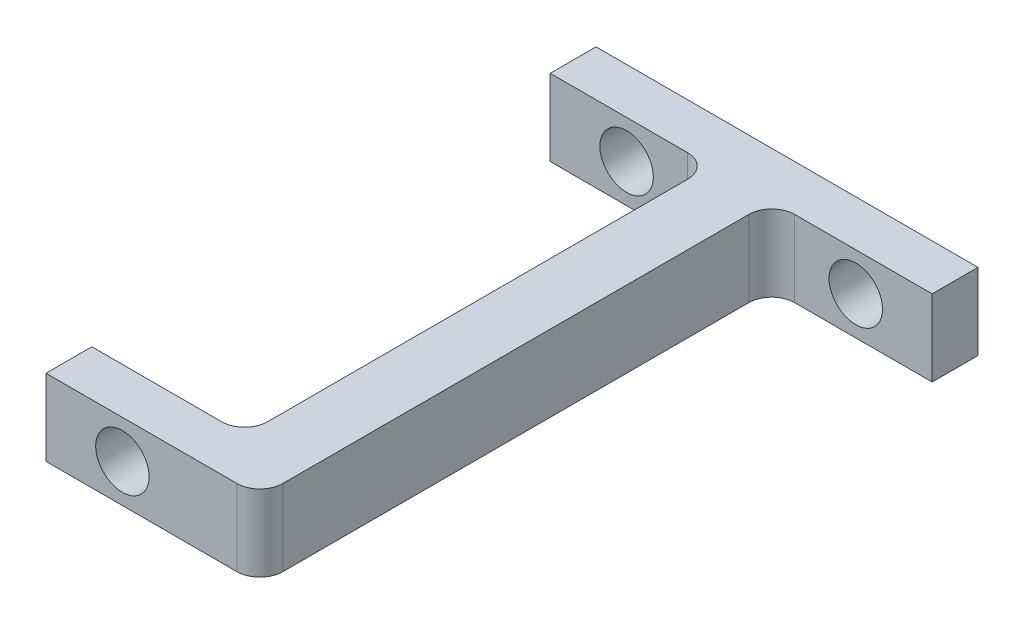
ISO-10303-21;
HEADER;
FILE_DESCRIPTION(('STEP AP214'),'2;1');
FILE_NAME('part.step','',(''),(''),'','','');
FILE_SCHEMA(('AUTOMOTIVE_DESIGN { 1 0 10303 214 1 1 1 1 }'));
ENDSEC;
DATA;
#1=APPLICATION_CONTEXT('core data for automotive mechanical design processes');
#2=APPLICATION_PROTOCOL_DEFINITION('international standard','automotive_design',2000,#1);
#3=PRODUCT_CONTEXT('',#1,'mechanical');
#4=PRODUCT('Part','Part','',(#3));
#5=PRODUCT_RELATED_PRODUCT_CATEGORY('part','',(#4));
#6=PRODUCT_DEFINITION_FORMATION('','',#4);
#7=PRODUCT_DEFINITION_CONTEXT('part definition',#1,'design');
#8=PRODUCT_DEFINITION('design','',#6,#7);
#9=PRODUCT_DEFINITION_SHAPE('','',#8);
#10=(LENGTH_UNIT() NAMED_UNIT(*) SI_UNIT(.MILLI.,.METRE.));
#11=(NAMED_UNIT(*) PLANE_ANGLE_UNIT() SI_UNIT($,.RADIAN.));
#12=(NAMED_UNIT(*) SI_UNIT($,.STERADIAN.) SOLID_ANGLE_UNIT());
#13=UNCERTAINTY_MEASURE_WITH_UNIT(LENGTH_MEASURE(1.E-05),#10,'distance_accuracy_value','');
#14=(GEOMETRIC_REPRESENTATION_CONTEXT(3) GLOBAL_UNCERTAINTY_ASSIGNED_CONTEXT((#13)) GLOBAL_UNIT_ASSIGNED_CONTEXT((#10,
#11,#12)) REPRESENTATION_CONTEXT('',''));
#15=CARTESIAN_POINT('',(0.,0.,0.));
#16=DIRECTION('',(0.,0.,1.));
#17=DIRECTION('',(1.,0.,0.));
#18=AXIS2_PLACEMENT_3D('',#15,#16,#17);
#19=CARTESIAN_POINT('',(-2.,-2.5,36.5));
#20=DIRECTION('',(1.,0.,0.));
#21=DIRECTION('',(0.,0.,-1.));
#22=AXIS2_PLACEMENT_3D('',#19,#20,#21);
#23=PLANE('',#22);
#24=DIRECTION('',(0.,0.,-1.));
#25=VECTOR('',#24,1.);
#26=CARTESIAN_POINT('',(-2.,2.5,36.5));
#27=LINE('',#26,#25);
#28=CARTESIAN_POINT('',(-2.,2.5,32.));
#29=VERTEX_POINT('',#28);
#30=CARTESIAN_POINT('',(-2.,2.5,4.5));
#31=VERTEX_POINT('',#30);
#32=EDGE_CURVE('E156',#29,#31,#27,.T.);
#33=ORIENTED_EDGE('',*,*,#32,.T.);
#34=DIRECTION('',(0.,-1.,0.));
#35=VECTOR('',#34,1.);
#36=CARTESIAN_POINT('',(-2.,-2.5,4.5));
#37=LINE('',#36,#35);
#38=CARTESIAN_POINT('',(-2.,-2.5,4.5));
#39=VERTEX_POINT('',#38);
#40=EDGE_CURVE('E284',#31,#39,#37,.T.);
#41=ORIENTED_EDGE('',*,*,#40,.T.);
#42=DIRECTION('',(0.,0.,-1.));
#43=VECTOR('',#42,1.);
#44=CARTESIAN_POINT('',(-2.,-2.5,36.5));
#45=LINE('',#44,#43);
#46=CARTESIAN_POINT('',(-2.,-2.5,32.));
#47=VERTEX_POINT('',#46);
#48=EDGE_CURVE('E205',#47,#39,#45,.T.);
#49=ORIENTED_EDGE('',*,*,#48,.F.);
#50=DIRECTION('',(0.,-1.,0.));
#51=VECTOR('',#50,1.);
#52=CARTESIAN_POINT('',(-2.,2.5,32.));
#53=LINE('',#52,#51);
#54=EDGE_CURVE('E281',#47,#29,#53,.F.);
#55=ORIENTED_EDGE('',*,*,#54,.T.);
#56=EDGE_LOOP('',(#33,#41,#49,#55));
#57=FACE_BOUND('',#56,.T.);
#58=ADVANCED_FACE('F45',(#57),#23,.F.);
#59=CARTESIAN_POINT('',(0.,0.,3.));
#60=DIRECTION('',(0.,0.,-1.));
#61=DIRECTION('',(-1.,0.,0.));
#62=AXIS2_PLACEMENT_3D('',#59,#60,#61);
#63=PLANE('',#62);
#64=CARTESIAN_POINT('',(-7.5,0.,3.));
#65=DIRECTION('',(0.,0.,1.));
#66=DIRECTION('',(1.,0.,0.));
#67=AXIS2_PLACEMENT_3D('',#64,#65,#66);
#68=CIRCLE('',#67,1.75);
#69=CARTESIAN_POINT('',(-5.75,0.,3.));
#70=VERTEX_POINT('',#69);
#71=EDGE_CURVE('E218',#70,#70,#68,.T.);
#72=ORIENTED_EDGE('',*,*,#71,.F.);
#73=EDGE_LOOP('',(#72));
#74=FACE_BOUND('',#73,.T.);
#75=DIRECTION('',(1.,0.,0.));
#76=VECTOR('',#75,1.);
#77=CARTESIAN_POINT('',(-12.5,-2.5,3.));
#78=LINE('',#77,#76);
#79=CARTESIAN_POINT('',(-12.5,-2.5,3.));
#80=VERTEX_POINT('',#79);
#81=CARTESIAN_POINT('',(-3.5,-2.5,3.));
#82=VERTEX_POINT('',#81);
#83=EDGE_CURVE('E240',#80,#82,#78,.T.);
#84=ORIENTED_EDGE('',*,*,#83,.T.);
#85=DIRECTION('',(0.,-1.,0.));
#86=VECTOR('',#85,1.);
#87=CARTESIAN_POINT('',(-3.5,2.5,3.));
#88=LINE('',#87,#86);
#89=CARTESIAN_POINT('',(-3.5,2.5,3.));
#90=VERTEX_POINT('',#89);
#91=EDGE_CURVE('E288',#82,#90,#88,.F.);
#92=ORIENTED_EDGE('',*,*,#91,.T.);
#93=DIRECTION('',(-1.,0.,0.));
#94=VECTOR('',#93,1.);
#95=CARTESIAN_POINT('',(-12.5,2.5,3.));
#96=LINE('',#95,#94);
#97=CARTESIAN_POINT('',(-12.5,2.5,3.));
#98=VERTEX_POINT('',#97);
#99=EDGE_CURVE('E230',#90,#98,#96,.T.);
#100=ORIENTED_EDGE('',*,*,#99,.T.);
#101=DIRECTION('',(0.,-1.,0.));
#102=VECTOR('',#101,1.);
#103=CARTESIAN_POINT('',(-12.5,-2.5,3.));
#104=LINE('',#103,#102);
#105=EDGE_CURVE('E236',#98,#80,#104,.T.);
#106=ORIENTED_EDGE('',*,*,#105,.T.);
#107=EDGE_LOOP('',(#84,#92,#100,#106));
#108=FACE_BOUND('',#107,.T.);
#109=ADVANCED_FACE('F357',(#74,#108),#63,.F.);
#110=CARTESIAN_POINT('',(7.5,0.,3.));
#111=DIRECTION('',(0.,0.,1.));
#112=DIRECTION('',(-1.,0.,0.));
#113=AXIS2_PLACEMENT_3D('',#110,#111,#112);
#114=CIRCLE('',#113,1.75);
#115=CARTESIAN_POINT('',(5.75,0.,3.));
#116=VERTEX_POINT('',#115);
#117=EDGE_CURVE('E210',#116,#116,#114,.T.);
#118=ORIENTED_EDGE('',*,*,#117,.F.);
#119=EDGE_LOOP('',(#118));
#120=FACE_BOUND('',#119,.T.);
#121=CARTESIAN_POINT('',(12.5,2.5,3.));
#122=VERTEX_POINT('',#121);
#123=CARTESIAN_POINT('',(3.5,2.5,3.));
#124=VERTEX_POINT('',#123);
#125=EDGE_CURVE('E232',#122,#124,#96,.T.);
#126=ORIENTED_EDGE('',*,*,#125,.T.);
#127=DIRECTION('',(0.,1.,0.));
#128=VECTOR('',#127,1.);
#129=CARTESIAN_POINT('',(3.5,-2.5,3.));
#130=LINE('',#129,#128);
#131=CARTESIAN_POINT('',(3.5,-2.5,3.));
#132=VERTEX_POINT('',#131);
#133=EDGE_CURVE('E278',#124,#132,#130,.F.);
#134=ORIENTED_EDGE('',*,*,#133,.T.);
#135=CARTESIAN_POINT('',(12.5,-2.5,3.));
#136=VERTEX_POINT('',#135);
#137=EDGE_CURVE('E239',#132,#136,#78,.T.);
#138=ORIENTED_EDGE('',*,*,#137,.T.);
#139=DIRECTION('',(0.,1.,0.));
#140=VECTOR('',#139,1.);
#141=CARTESIAN_POINT('',(12.5,-2.5,3.));
#142=LINE('',#141,#140);
#143=EDGE_CURVE('E226',#136,#122,#142,.T.);
#144=ORIENTED_EDGE('',*,*,#143,.T.);
#145=EDGE_LOOP('',(#126,#134,#138,#144));
#146=FACE_BOUND('',#145,.T.);
#147=ADVANCED_FACE('F337',(#120,#146),#63,.F.);
#148=CARTESIAN_POINT('',(0.,0.,0.));
#149=DIRECTION('',(0.,0.,-1.));
#150=DIRECTION('',(-1.,0.,0.));
#151=AXIS2_PLACEMENT_3D('',#148,#149,#150);
#152=PLANE('',#151);
#153=CARTESIAN_POINT('',(-7.5,0.,0.));
#154=DIRECTION('',(0.,0.,1.));
#155=DIRECTION('',(1.,0.,0.));
#156=AXIS2_PLACEMENT_3D('',#153,#154,#155);
#157=CIRCLE('',#156,1.75);
#158=CARTESIAN_POINT('',(-5.75,0.,0.));
#159=VERTEX_POINT('',#158);
#160=EDGE_CURVE('E214',#159,#159,#157,.T.);
#161=ORIENTED_EDGE('',*,*,#160,.T.);
#162=EDGE_LOOP('',(#161));
#163=FACE_BOUND('',#162,.T.);
#164=DIRECTION('',(0.,1.,0.));
#165=VECTOR('',#164,1.);
#166=CARTESIAN_POINT('',(12.5,-2.5,0.));
#167=LINE('',#166,#165);
#168=CARTESIAN_POINT('',(12.5,-2.5,0.));
#169=VERTEX_POINT('',#168);
#170=CARTESIAN_POINT('',(12.5,2.5,0.));
#171=VERTEX_POINT('',#170);
#172=EDGE_CURVE('E222',#169,#171,#167,.T.);
#173=ORIENTED_EDGE('',*,*,#172,.F.);
#174=DIRECTION('',(1.,0.,0.));
#175=VECTOR('',#174,1.);
#176=CARTESIAN_POINT('',(-12.5,-2.5,0.));
#177=LINE('',#176,#175);
#178=CARTESIAN_POINT('',(-12.5,-2.5,0.));
#179=VERTEX_POINT('',#178);
#180=EDGE_CURVE('E231',#179,#169,#177,.T.);
#181=ORIENTED_EDGE('',*,*,#180,.F.);
#182=DIRECTION('',(0.,-1.,0.));
#183=VECTOR('',#182,1.);
#184=CARTESIAN_POINT('',(-12.5,-2.5,0.));
#185=LINE('',#184,#183);
#186=CARTESIAN_POINT('',(-12.5,2.5,0.));
#187=VERTEX_POINT('',#186);
#188=EDGE_CURVE('E251',#187,#179,#185,.T.);
#189=ORIENTED_EDGE('',*,*,#188,.F.);
#190=DIRECTION('',(-1.,0.,0.));
#191=VECTOR('',#190,1.);
#192=CARTESIAN_POINT('',(-12.5,2.5,0.));
#193=LINE('',#192,#191);
#194=EDGE_CURVE('E248',#171,#187,#193,.T.);
#195=ORIENTED_EDGE('',*,*,#194,.F.);
#196=EDGE_LOOP('',(#173,#181,#189,#195));
#197=FACE_BOUND('',#196,.T.);
#198=CARTESIAN_POINT('',(7.5,0.,0.));
#199=DIRECTION('',(0.,0.,1.));
#200=DIRECTION('',(-1.,0.,0.));
#201=AXIS2_PLACEMENT_3D('',#198,#199,#200);
#202=CIRCLE('',#201,1.75);
#203=CARTESIAN_POINT('',(5.75,0.,0.));
#204=VERTEX_POINT('',#203);
#205=EDGE_CURVE('E209',#204,#204,#202,.T.);
#206=ORIENTED_EDGE('',*,*,#205,.T.);
#207=EDGE_LOOP('',(#206));
#208=FACE_BOUND('',#207,.T.);
#209=ADVANCED_FACE('F352',(#163,#197,#208),#152,.T.);
#210=CARTESIAN_POINT('',(12.5,-2.5,3.));
#211=DIRECTION('',(-1.,0.,0.));
#212=DIRECTION('',(0.,0.,1.));
#213=AXIS2_PLACEMENT_3D('',#210,#211,#212);
#214=PLANE('',#213);
#215=ORIENTED_EDGE('',*,*,#172,.T.);
#216=DIRECTION('',(0.,0.,-1.));
#217=VECTOR('',#216,1.);
#218=CARTESIAN_POINT('',(12.5,2.5,3.));
#219=LINE('',#218,#217);
#220=EDGE_CURVE('E267',#122,#171,#219,.T.);
#221=ORIENTED_EDGE('',*,*,#220,.F.);
#222=ORIENTED_EDGE('',*,*,#143,.F.);
#223=DIRECTION('',(0.,0.,-1.));
#224=VECTOR('',#223,1.);
#225=CARTESIAN_POINT('',(12.5,-2.5,3.));
#226=LINE('',#225,#224);
#227=EDGE_CURVE('E244',#136,#169,#226,.T.);
#228=ORIENTED_EDGE('',*,*,#227,.T.);
#229=EDGE_LOOP('',(#215,#221,#222,#228));
#230=FACE_BOUND('',#229,.T.);
#231=ADVANCED_FACE('F341',(#230),#214,.F.);
#232=CARTESIAN_POINT('',(-12.5,2.5,3.));
#233=DIRECTION('',(0.,-1.,0.));
#234=DIRECTION('',(0.,0.,-1.));
#235=AXIS2_PLACEMENT_3D('',#232,#233,#234);
#236=PLANE('',#235);
#237=DIRECTION('',(-1.,0.,0.));
#238=VECTOR('',#237,1.);
#239=CARTESIAN_POINT('',(2.,2.5,36.5));
#240=LINE('',#239,#238);
#241=CARTESIAN_POINT('',(0.500000000000002,2.5,36.5));
#242=VERTEX_POINT('',#241);
#243=CARTESIAN_POINT('',(-12.,2.5,36.5));
#244=VERTEX_POINT('',#243);
#245=EDGE_CURVE('E148',#242,#244,#240,.T.);
#246=ORIENTED_EDGE('',*,*,#245,.F.);
#247=CARTESIAN_POINT('',(0.500000000000002,2.5,35.));
#248=DIRECTION('',(0.,-1.,0.));
#249=DIRECTION('',(0.,0.,-1.));
#250=AXIS2_PLACEMENT_3D('',#247,#248,#249);
#251=CIRCLE('',#250,1.5);
#252=CARTESIAN_POINT('',(2.,2.5,35.));
#253=VERTEX_POINT('',#252);
#254=EDGE_CURVE('E69',#242,#253,#251,.F.);
#255=ORIENTED_EDGE('',*,*,#254,.T.);
#256=DIRECTION('',(0.,0.,-1.));
#257=VECTOR('',#256,1.);
#258=CARTESIAN_POINT('',(2.,2.5,36.5));
#259=LINE('',#258,#257);
#260=CARTESIAN_POINT('',(2.,2.5,4.5));
#261=VERTEX_POINT('',#260);
#262=EDGE_CURVE('E197',#253,#261,#259,.T.);
#263=ORIENTED_EDGE('',*,*,#262,.T.);
#264=CARTESIAN_POINT('',(3.5,2.5,4.5));
#265=DIRECTION('',(0.,-1.,0.));
#266=DIRECTION('',(0.,0.,-1.));
#267=AXIS2_PLACEMENT_3D('',#264,#265,#266);
#268=CIRCLE('',#267,1.5);
#269=EDGE_CURVE('E301',#261,#124,#268,.T.);
#270=ORIENTED_EDGE('',*,*,#269,.T.);
#271=ORIENTED_EDGE('',*,*,#125,.F.);
#272=ORIENTED_EDGE('',*,*,#220,.T.);
#273=ORIENTED_EDGE('',*,*,#194,.T.);
#274=DIRECTION('',(0.,0.,-1.));
#275=VECTOR('',#274,1.);
#276=CARTESIAN_POINT('',(-12.5,2.5,3.));
#277=LINE('',#276,#275);
#278=EDGE_CURVE('E263',#98,#187,#277,.T.);
#279=ORIENTED_EDGE('',*,*,#278,.F.);
#280=ORIENTED_EDGE('',*,*,#99,.F.);
#281=CARTESIAN_POINT('',(-3.5,2.5,4.5));
#282=DIRECTION('',(0.,-1.,0.));
#283=DIRECTION('',(0.,0.,-1.));
#284=AXIS2_PLACEMENT_3D('',#281,#282,#283);
#285=CIRCLE('',#284,1.5);
#286=EDGE_CURVE('E310',#90,#31,#285,.T.);
#287=ORIENTED_EDGE('',*,*,#286,.T.);
#288=ORIENTED_EDGE('',*,*,#32,.F.);
#289=CARTESIAN_POINT('',(-3.5,2.5,32.));
#290=DIRECTION('',(0.,-1.,0.));
#291=DIRECTION('',(0.,0.,-1.));
#292=AXIS2_PLACEMENT_3D('',#289,#290,#291);
#293=CIRCLE('',#292,1.5);
#294=CARTESIAN_POINT('',(-3.5,2.5,33.5));
#295=VERTEX_POINT('',#294);
#296=EDGE_CURVE('E11',#29,#295,#293,.T.);
#297=ORIENTED_EDGE('',*,*,#296,.T.);
#298=DIRECTION('',(1.,0.,0.));
#299=VECTOR('',#298,1.);
#300=CARTESIAN_POINT('',(-12.,2.5,33.5));
#301=LINE('',#300,#299);
#302=CARTESIAN_POINT('',(-12.,2.5,33.5));
#303=VERTEX_POINT('',#302);
#304=EDGE_CURVE('E163',#303,#295,#301,.T.);
#305=ORIENTED_EDGE('',*,*,#304,.F.);
#306=DIRECTION('',(0.,0.,-1.));
#307=VECTOR('',#306,1.);
#308=CARTESIAN_POINT('',(-12.,2.5,33.5));
#309=LINE('',#308,#307);
#310=EDGE_CURVE('E160',#244,#303,#309,.T.);
#311=ORIENTED_EDGE('',*,*,#310,.F.);
#312=EDGE_LOOP('',(#246,#255,#263,#270,#271,#272,#273,#279,#280,#287,#288,#297,#305,#311));
#313=FACE_BOUND('',#312,.T.);
#314=ADVANCED_FACE('F161',(#313),#236,.F.);
#315=CARTESIAN_POINT('',(-12.5,-2.5,3.));
#316=DIRECTION('',(1.,0.,0.));
#317=DIRECTION('',(0.,0.,-1.));
#318=AXIS2_PLACEMENT_3D('',#315,#316,#317);
#319=PLANE('',#318);
#320=ORIENTED_EDGE('',*,*,#188,.T.);
#321=DIRECTION('',(0.,0.,-1.));
#322=VECTOR('',#321,1.);
#323=CARTESIAN_POINT('',(-12.5,-2.5,3.));
#324=LINE('',#323,#322);
#325=EDGE_CURVE('E259',#80,#179,#324,.T.);
#326=ORIENTED_EDGE('',*,*,#325,.F.);
#327=ORIENTED_EDGE('',*,*,#105,.F.);
#328=ORIENTED_EDGE('',*,*,#278,.T.);
#329=EDGE_LOOP('',(#320,#326,#327,#328));
#330=FACE_BOUND('',#329,.T.);
#331=ADVANCED_FACE('F349',(#330),#319,.F.);
#332=CARTESIAN_POINT('',(-12.5,-2.5,3.));
#333=DIRECTION('',(0.,1.,0.));
#334=DIRECTION('',(0.,0.,1.));
#335=AXIS2_PLACEMENT_3D('',#332,#333,#334);
#336=PLANE('',#335);
#337=DIRECTION('',(0.,0.,-1.));
#338=VECTOR('',#337,1.);
#339=CARTESIAN_POINT('',(2.,-2.5,36.5));
#340=LINE('',#339,#338);
#341=CARTESIAN_POINT('',(2.,-2.5,35.));
#342=VERTEX_POINT('',#341);
#343=CARTESIAN_POINT('',(2.,-2.5,4.5));
#344=VERTEX_POINT('',#343);
#345=EDGE_CURVE('E201',#342,#344,#340,.T.);
#346=ORIENTED_EDGE('',*,*,#345,.F.);
#347=CARTESIAN_POINT('',(0.500000000000002,-2.5,35.));
#348=DIRECTION('',(0.,1.,0.));
#349=DIRECTION('',(0.,0.,1.));
#350=AXIS2_PLACEMENT_3D('',#347,#348,#349);
#351=CIRCLE('',#350,1.5);
#352=CARTESIAN_POINT('',(0.500000000000002,-2.5,36.5));
#353=VERTEX_POINT('',#352);
#354=EDGE_CURVE('E61',#342,#353,#351,.F.);
#355=ORIENTED_EDGE('',*,*,#354,.T.);
#356=DIRECTION('',(1.,0.,0.));
#357=VECTOR('',#356,1.);
#358=CARTESIAN_POINT('',(2.,-2.5,36.5));
#359=LINE('',#358,#357);
#360=CARTESIAN_POINT('',(-12.,-2.5,36.5));
#361=VERTEX_POINT('',#360);
#362=EDGE_CURVE('E157',#361,#353,#359,.T.);
#363=ORIENTED_EDGE('',*,*,#362,.F.);
#364=DIRECTION('',(0.,0.,1.));
#365=VECTOR('',#364,1.);
#366=CARTESIAN_POINT('',(-12.,-2.5,33.5));
#367=LINE('',#366,#365);
#368=CARTESIAN_POINT('',(-12.,-2.5,33.5));
#369=VERTEX_POINT('',#368);
#370=EDGE_CURVE('E172',#369,#361,#367,.T.);
#371=ORIENTED_EDGE('',*,*,#370,.F.);
#372=DIRECTION('',(1.,0.,0.));
#373=VECTOR('',#372,1.);
#374=CARTESIAN_POINT('',(-12.,-2.5,33.5));
#375=LINE('',#374,#373);
#376=CARTESIAN_POINT('',(-3.5,-2.5,33.5));
#377=VERTEX_POINT('',#376);
#378=EDGE_CURVE('E186',#369,#377,#375,.T.);
#379=ORIENTED_EDGE('',*,*,#378,.T.);
#380=CARTESIAN_POINT('',(-3.5,-2.5,32.));
#381=DIRECTION('',(0.,1.,0.));
#382=DIRECTION('',(0.,0.,1.));
#383=AXIS2_PLACEMENT_3D('',#380,#381,#382);
#384=CIRCLE('',#383,1.5);
#385=EDGE_CURVE('E54',#377,#47,#384,.T.);
#386=ORIENTED_EDGE('',*,*,#385,.T.);
#387=ORIENTED_EDGE('',*,*,#48,.T.);
#388=CARTESIAN_POINT('',(-3.5,-2.5,4.5));
#389=DIRECTION('',(0.,1.,0.));
#390=DIRECTION('',(0.,0.,1.));
#391=AXIS2_PLACEMENT_3D('',#388,#389,#390);
#392=CIRCLE('',#391,1.5);
#393=EDGE_CURVE('E307',#39,#82,#392,.T.);
#394=ORIENTED_EDGE('',*,*,#393,.T.);
#395=ORIENTED_EDGE('',*,*,#83,.F.);
#396=ORIENTED_EDGE('',*,*,#325,.T.);
#397=ORIENTED_EDGE('',*,*,#180,.T.);
#398=ORIENTED_EDGE('',*,*,#227,.F.);
#399=ORIENTED_EDGE('',*,*,#137,.F.);
#400=CARTESIAN_POINT('',(3.5,-2.5,4.5));
#401=DIRECTION('',(0.,1.,0.));
#402=DIRECTION('',(0.,0.,1.));
#403=AXIS2_PLACEMENT_3D('',#400,#401,#402);
#404=CIRCLE('',#403,1.5);
#405=EDGE_CURVE('E304',#132,#344,#404,.T.);
#406=ORIENTED_EDGE('',*,*,#405,.T.);
#407=EDGE_LOOP('',(#346,#355,#363,#371,#379,#386,#387,#394,#395,#396,#397,#398,#399,#406));
#408=FACE_BOUND('',#407,.T.);
#409=ADVANCED_FACE('F314',(#408),#336,.F.);
#410=CARTESIAN_POINT('',(-7.5,0.,3.));
#411=DIRECTION('',(0.,0.,-1.));
#412=DIRECTION('',(-1.,0.,0.));
#413=AXIS2_PLACEMENT_3D('',#410,#411,#412);
#414=CYLINDRICAL_SURFACE('',#413,1.75);
#415=ORIENTED_EDGE('',*,*,#71,.T.);
#416=EDGE_LOOP('',(#415));
#417=FACE_BOUND('',#416,.T.);
#418=ORIENTED_EDGE('',*,*,#160,.F.);
#419=EDGE_LOOP('',(#418));
#420=FACE_BOUND('',#419,.T.);
#421=ADVANCED_FACE('F385',(#417,#420),#414,.F.);
#422=CARTESIAN_POINT('',(7.5,0.,3.));
#423=DIRECTION('',(0.,0.,-1.));
#424=DIRECTION('',(-1.,0.,0.));
#425=AXIS2_PLACEMENT_3D('',#422,#423,#424);
#426=CYLINDRICAL_SURFACE('',#425,1.75);
#427=ORIENTED_EDGE('',*,*,#117,.T.);
#428=EDGE_LOOP('',(#427));
#429=FACE_BOUND('',#428,.T.);
#430=ORIENTED_EDGE('',*,*,#205,.F.);
#431=EDGE_LOOP('',(#430));
#432=FACE_BOUND('',#431,.T.);
#433=ADVANCED_FACE('F382',(#429,#432),#426,.F.);
#434=CARTESIAN_POINT('',(2.,-2.5,36.5));
#435=DIRECTION('',(-1.,0.,0.));
#436=DIRECTION('',(0.,0.,1.));
#437=AXIS2_PLACEMENT_3D('',#434,#435,#436);
#438=PLANE('',#437);
#439=ORIENTED_EDGE('',*,*,#345,.T.);
#440=DIRECTION('',(0.,1.,0.));
#441=VECTOR('',#440,1.);
#442=CARTESIAN_POINT('',(2.,2.5,4.5));
#443=LINE('',#442,#441);
#444=EDGE_CURVE('E274',#344,#261,#443,.T.);
#445=ORIENTED_EDGE('',*,*,#444,.T.);
#446=ORIENTED_EDGE('',*,*,#262,.F.);
#447=DIRECTION('',(0.,1.,0.));
#448=VECTOR('',#447,1.);
#449=CARTESIAN_POINT('',(2.,-2.5,35.));
#450=LINE('',#449,#448);
#451=EDGE_CURVE('E271',#253,#342,#450,.F.);
#452=ORIENTED_EDGE('',*,*,#451,.T.);
#453=EDGE_LOOP('',(#439,#445,#446,#452));
#454=FACE_BOUND('',#453,.T.);
#455=ADVANCED_FACE('F328',(#454),#438,.F.);
#456=CARTESIAN_POINT('',(0.,0.,36.5));
#457=DIRECTION('',(0.,0.,1.));
#458=DIRECTION('',(1.,0.,0.));
#459=AXIS2_PLACEMENT_3D('',#456,#457,#458);
#460=PLANE('',#459);
#461=CARTESIAN_POINT('',(-7.,0.,36.5));
#462=DIRECTION('',(0.,0.,1.));
#463=DIRECTION('',(1.,0.,0.));
#464=AXIS2_PLACEMENT_3D('',#461,#462,#463);
#465=CIRCLE('',#464,1.75);
#466=CARTESIAN_POINT('',(-5.25,0.,36.5));
#467=VERTEX_POINT('',#466);
#468=EDGE_CURVE('E174',#467,#467,#465,.T.);
#469=ORIENTED_EDGE('',*,*,#468,.F.);
#470=EDGE_LOOP('',(#469));
#471=FACE_BOUND('',#470,.T.);
#472=ORIENTED_EDGE('',*,*,#362,.T.);
#473=DIRECTION('',(0.,1.,0.));
#474=VECTOR('',#473,1.);
#475=CARTESIAN_POINT('',(0.500000000000002,2.5,36.5));
#476=LINE('',#475,#474);
#477=EDGE_CURVE('E153',#353,#242,#476,.T.);
#478=ORIENTED_EDGE('',*,*,#477,.T.);
#479=ORIENTED_EDGE('',*,*,#245,.T.);
#480=DIRECTION('',(0.,1.,0.));
#481=VECTOR('',#480,1.);
#482=CARTESIAN_POINT('',(-12.,-2.5,36.5));
#483=LINE('',#482,#481);
#484=EDGE_CURVE('E152',#361,#244,#483,.T.);
#485=ORIENTED_EDGE('',*,*,#484,.F.);
#486=EDGE_LOOP('',(#472,#478,#479,#485));
#487=FACE_BOUND('',#486,.T.);
#488=ADVANCED_FACE('F150',(#471,#487),#460,.T.);
#489=CARTESIAN_POINT('',(-12.,-2.5,33.5));
#490=DIRECTION('',(0.,0.,1.));
#491=DIRECTION('',(1.,0.,0.));
#492=AXIS2_PLACEMENT_3D('',#489,#490,#491);
#493=PLANE('',#492);
#494=CARTESIAN_POINT('',(-7.,0.,33.5));
#495=DIRECTION('',(0.,0.,-1.));
#496=DIRECTION('',(-1.,0.,0.));
#497=AXIS2_PLACEMENT_3D('',#494,#495,#496);
#498=CIRCLE('',#497,1.75);
#499=CARTESIAN_POINT('',(-8.75,0.,33.5));
#500=VERTEX_POINT('',#499);
#501=EDGE_CURVE('E178',#500,#500,#498,.T.);
#502=ORIENTED_EDGE('',*,*,#501,.F.);
#503=EDGE_LOOP('',(#502));
#504=FACE_BOUND('',#503,.T.);
#505=ORIENTED_EDGE('',*,*,#304,.T.);
#506=DIRECTION('',(0.,-1.,0.));
#507=VECTOR('',#506,1.);
#508=CARTESIAN_POINT('',(-3.5,-2.5,33.5));
#509=LINE('',#508,#507);
#510=EDGE_CURVE('E291',#295,#377,#509,.T.);
#511=ORIENTED_EDGE('',*,*,#510,.T.);
#512=ORIENTED_EDGE('',*,*,#378,.F.);
#513=DIRECTION('',(0.,-1.,0.));
#514=VECTOR('',#513,1.);
#515=CARTESIAN_POINT('',(-12.,-2.5,33.5));
#516=LINE('',#515,#514);
#517=EDGE_CURVE('E167',#303,#369,#516,.T.);
#518=ORIENTED_EDGE('',*,*,#517,.F.);
#519=EDGE_LOOP('',(#505,#511,#512,#518));
#520=FACE_BOUND('',#519,.T.);
#521=ADVANCED_FACE('F325',(#504,#520),#493,.F.);
#522=CARTESIAN_POINT('',(-12.,0.,0.));
#523=DIRECTION('',(1.,0.,0.));
#524=DIRECTION('',(0.,0.,-1.));
#525=AXIS2_PLACEMENT_3D('',#522,#523,#524);
#526=PLANE('',#525);
#527=ORIENTED_EDGE('',*,*,#484,.T.);
#528=ORIENTED_EDGE('',*,*,#310,.T.);
#529=ORIENTED_EDGE('',*,*,#517,.T.);
#530=ORIENTED_EDGE('',*,*,#370,.T.);
#531=EDGE_LOOP('',(#527,#528,#529,#530));
#532=FACE_BOUND('',#531,.T.);
#533=ADVANCED_FACE('F170',(#532),#526,.F.);
#534=CARTESIAN_POINT('',(-7.,0.,43.5));
#535=DIRECTION('',(0.,0.,-1.));
#536=DIRECTION('',(-1.,0.,0.));
#537=AXIS2_PLACEMENT_3D('',#534,#535,#536);
#538=CYLINDRICAL_SURFACE('',#537,1.75);
#539=ORIENTED_EDGE('',*,*,#468,.T.);
#540=EDGE_LOOP('',(#539));
#541=FACE_BOUND('',#540,.T.);
#542=ORIENTED_EDGE('',*,*,#501,.T.);
#543=EDGE_LOOP('',(#542));
#544=FACE_BOUND('',#543,.T.);
#545=ADVANCED_FACE('F369',(#541,#544),#538,.F.);
#546=CARTESIAN_POINT('',(3.5,-2.5,4.5));
#547=DIRECTION('',(0.,-1.,0.));
#548=DIRECTION('',(0.,0.,-1.));
#549=AXIS2_PLACEMENT_3D('',#546,#547,#548);
#550=CYLINDRICAL_SURFACE('',#549,1.5);
#551=ORIENTED_EDGE('',*,*,#405,.F.);
#552=ORIENTED_EDGE('',*,*,#133,.F.);
#553=ORIENTED_EDGE('',*,*,#269,.F.);
#554=ORIENTED_EDGE('',*,*,#444,.F.);
#555=EDGE_LOOP('',(#551,#552,#553,#554));
#556=FACE_BOUND('',#555,.T.);
#557=ADVANCED_FACE('F335',(#556),#550,.F.);
#558=CARTESIAN_POINT('',(-3.5,-2.5,4.5));
#559=DIRECTION('',(0.,1.,0.));
#560=DIRECTION('',(0.,0.,1.));
#561=AXIS2_PLACEMENT_3D('',#558,#559,#560);
#562=CYLINDRICAL_SURFACE('',#561,1.5);
#563=ORIENTED_EDGE('',*,*,#286,.F.);
#564=ORIENTED_EDGE('',*,*,#91,.F.);
#565=ORIENTED_EDGE('',*,*,#393,.F.);
#566=ORIENTED_EDGE('',*,*,#40,.F.);
#567=EDGE_LOOP('',(#563,#564,#565,#566));
#568=FACE_BOUND('',#567,.T.);
#569=ADVANCED_FACE('F360',(#568),#562,.F.);
#570=CARTESIAN_POINT('',(-3.5,-2.5,32.));
#571=DIRECTION('',(0.,1.,0.));
#572=DIRECTION('',(0.,0.,1.));
#573=AXIS2_PLACEMENT_3D('',#570,#571,#572);
#574=CYLINDRICAL_SURFACE('',#573,1.5);
#575=ORIENTED_EDGE('',*,*,#296,.F.);
#576=ORIENTED_EDGE('',*,*,#54,.F.);
#577=ORIENTED_EDGE('',*,*,#385,.F.);
#578=ORIENTED_EDGE('',*,*,#510,.F.);
#579=EDGE_LOOP('',(#575,#576,#577,#578));
#580=FACE_BOUND('',#579,.T.);
#581=ADVANCED_FACE('F323',(#580),#574,.F.);
#582=CARTESIAN_POINT('',(0.500000000000002,0.,35.));
#583=DIRECTION('',(0.,-1.,0.));
#584=DIRECTION('',(0.,0.,-1.));
#585=AXIS2_PLACEMENT_3D('',#582,#583,#584);
#586=CYLINDRICAL_SURFACE('',#585,1.5);
#587=ORIENTED_EDGE('',*,*,#354,.F.);
#588=ORIENTED_EDGE('',*,*,#451,.F.);
#589=ORIENTED_EDGE('',*,*,#254,.F.);
#590=ORIENTED_EDGE('',*,*,#477,.F.);
#591=EDGE_LOOP('',(#587,#588,#589,#590));
#592=FACE_BOUND('',#591,.T.);
#593=ADVANCED_FACE('F47',(#592),#586,.T.);
#594=CLOSED_SHELL('',(#58,#109,#147,#209,#231,#314,#331,#409,#421,#433,#455,#488,#521,#533,#545,
#557,#569,#581,#593));
#595=MANIFOLD_SOLID_BREP('B2',#594);
#596=ADVANCED_BREP_SHAPE_REPRESENTATION('',(#18,#595),#14);
#597=SHAPE_DEFINITION_REPRESENTATION(#9,#596);
ENDSEC;
END-ISO-10303-21;
